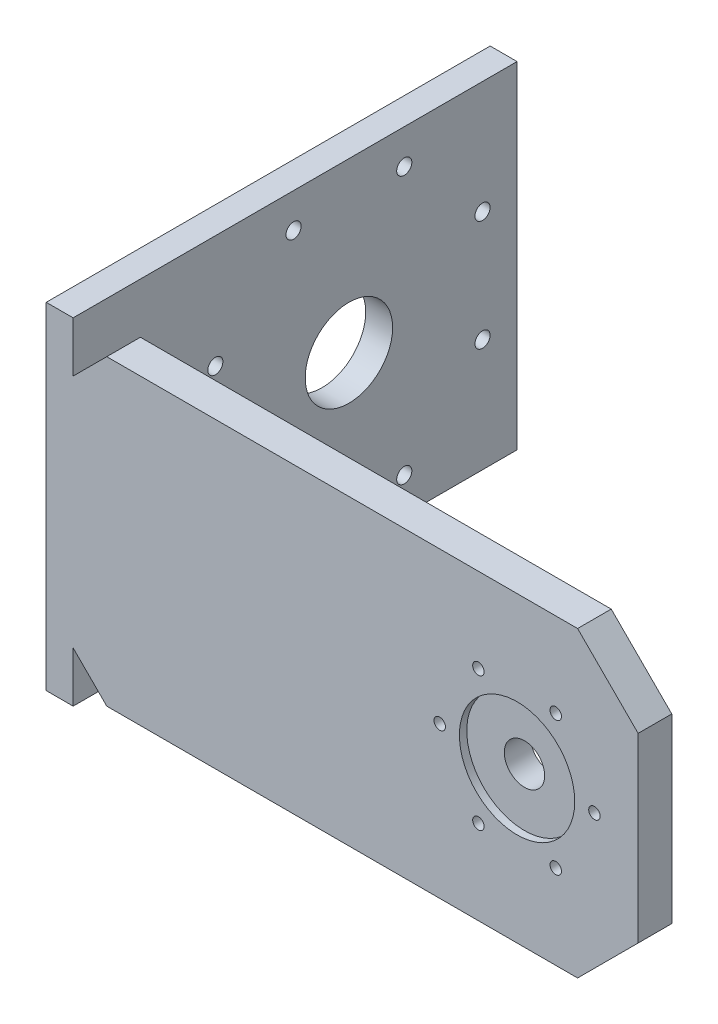
ISO-10303-21;
HEADER;
FILE_DESCRIPTION(('STEP AP214'),'2;1');
FILE_NAME('part.step','',(''),(''),'','','');
FILE_SCHEMA(('AUTOMOTIVE_DESIGN { 1 0 10303 214 1 1 1 1 }'));
ENDSEC;
DATA;
#1=APPLICATION_CONTEXT('core data for automotive mechanical design processes');
#2=APPLICATION_PROTOCOL_DEFINITION('international standard','automotive_design',2000,#1);
#3=PRODUCT_CONTEXT('',#1,'mechanical');
#4=PRODUCT('Part','Part','',(#3));
#5=PRODUCT_RELATED_PRODUCT_CATEGORY('part','',(#4));
#6=PRODUCT_DEFINITION_FORMATION('','',#4);
#7=PRODUCT_DEFINITION_CONTEXT('part definition',#1,'design');
#8=PRODUCT_DEFINITION('design','',#6,#7);
#9=PRODUCT_DEFINITION_SHAPE('','',#8);
#10=(LENGTH_UNIT() NAMED_UNIT(*) SI_UNIT(.MILLI.,.METRE.));
#11=(NAMED_UNIT(*) PLANE_ANGLE_UNIT() SI_UNIT($,.RADIAN.));
#12=(NAMED_UNIT(*) SI_UNIT($,.STERADIAN.) SOLID_ANGLE_UNIT());
#13=UNCERTAINTY_MEASURE_WITH_UNIT(LENGTH_MEASURE(1.E-05),#10,'distance_accuracy_value','');
#14=(GEOMETRIC_REPRESENTATION_CONTEXT(3) GLOBAL_UNCERTAINTY_ASSIGNED_CONTEXT((#13)) GLOBAL_UNIT_ASSIGNED_CONTEXT((#10,
#11,#12)) REPRESENTATION_CONTEXT('',''));
#15=CARTESIAN_POINT('',(0.,0.,0.));
#16=DIRECTION('',(0.,0.,1.));
#17=DIRECTION('',(1.,0.,0.));
#18=AXIS2_PLACEMENT_3D('',#15,#16,#17);
#19=CARTESIAN_POINT('',(0.,0.,72.));
#20=DIRECTION('',(0.,0.,-1.));
#21=DIRECTION('',(-1.,0.,0.));
#22=AXIS2_PLACEMENT_3D('',#19,#20,#21);
#23=PLANE('',#22);
#24=CARTESIAN_POINT('',(11.5,19.9185842870421,72.));
#25=DIRECTION('',(0.,0.,1.));
#26=DIRECTION('',(1.,0.,0.));
#27=AXIS2_PLACEMENT_3D('',#24,#25,#26);
#28=CIRCLE('',#27,1.7);
#29=CARTESIAN_POINT('',(13.2,19.9185842870421,72.));
#30=VERTEX_POINT('',#29);
#31=EDGE_CURVE('E268',#30,#30,#28,.T.);
#32=ORIENTED_EDGE('',*,*,#31,.T.);
#33=EDGE_LOOP('',(#32));
#34=FACE_BOUND('',#33,.T.);
#35=CARTESIAN_POINT('',(-23.,0.,72.));
#36=DIRECTION('',(0.,0.,1.));
#37=DIRECTION('',(1.,0.,0.));
#38=AXIS2_PLACEMENT_3D('',#35,#36,#37);
#39=CIRCLE('',#38,1.7);
#40=CARTESIAN_POINT('',(-21.3,0.,72.));
#41=VERTEX_POINT('',#40);
#42=EDGE_CURVE('E279',#41,#41,#39,.T.);
#43=ORIENTED_EDGE('',*,*,#42,.T.);
#44=EDGE_LOOP('',(#43));
#45=FACE_BOUND('',#44,.T.);
#46=CARTESIAN_POINT('',(11.5,-19.9185842870421,72.));
#47=DIRECTION('',(0.,0.,1.));
#48=DIRECTION('',(1.,0.,0.));
#49=AXIS2_PLACEMENT_3D('',#46,#47,#48);
#50=CIRCLE('',#49,1.7);
#51=CARTESIAN_POINT('',(13.2,-19.9185842870421,72.));
#52=VERTEX_POINT('',#51);
#53=EDGE_CURVE('E288',#52,#52,#50,.T.);
#54=ORIENTED_EDGE('',*,*,#53,.T.);
#55=EDGE_LOOP('',(#54));
#56=FACE_BOUND('',#55,.T.);
#57=CARTESIAN_POINT('',(23.,0.,72.));
#58=DIRECTION('',(0.,0.,1.));
#59=DIRECTION('',(1.,0.,0.));
#60=AXIS2_PLACEMENT_3D('',#57,#58,#59);
#61=CIRCLE('',#60,1.7);
#62=CARTESIAN_POINT('',(24.7,0.,72.));
#63=VERTEX_POINT('',#62);
#64=EDGE_CURVE('E299',#63,#63,#61,.T.);
#65=ORIENTED_EDGE('',*,*,#64,.T.);
#66=EDGE_LOOP('',(#65));
#67=FACE_BOUND('',#66,.T.);
#68=CARTESIAN_POINT('',(-11.5,-19.9185842870421,72.));
#69=DIRECTION('',(0.,0.,1.));
#70=DIRECTION('',(1.,0.,0.));
#71=AXIS2_PLACEMENT_3D('',#68,#69,#70);
#72=CIRCLE('',#71,1.7);
#73=CARTESIAN_POINT('',(-9.79999999999999,-19.9185842870421,72.));
#74=VERTEX_POINT('',#73);
#75=EDGE_CURVE('E283',#74,#74,#72,.T.);
#76=ORIENTED_EDGE('',*,*,#75,.T.);
#77=EDGE_LOOP('',(#76));
#78=FACE_BOUND('',#77,.T.);
#79=CARTESIAN_POINT('',(-11.5,19.9185842870421,72.));
#80=DIRECTION('',(0.,0.,1.));
#81=DIRECTION('',(1.,0.,0.));
#82=AXIS2_PLACEMENT_3D('',#79,#80,#81);
#83=CIRCLE('',#82,1.7);
#84=CARTESIAN_POINT('',(-9.80000000000001,19.9185842870421,72.));
#85=VERTEX_POINT('',#84);
#86=EDGE_CURVE('E275',#85,#85,#83,.T.);
#87=ORIENTED_EDGE('',*,*,#86,.T.);
#88=EDGE_LOOP('',(#87));
#89=FACE_BOUND('',#88,.T.);
#90=CARTESIAN_POINT('',(0.,0.,72.));
#91=DIRECTION('',(0.,0.,1.));
#92=DIRECTION('',(1.,0.,0.));
#93=AXIS2_PLACEMENT_3D('',#90,#91,#92);
#94=CIRCLE('',#93,6.);
#95=CARTESIAN_POINT('',(6.,0.,72.));
#96=VERTEX_POINT('',#95);
#97=EDGE_CURVE('E264',#96,#96,#94,.T.);
#98=ORIENTED_EDGE('',*,*,#97,.T.);
#99=EDGE_LOOP('',(#98));
#100=FACE_BOUND('',#99,.T.);
#101=DIRECTION('',(0.,1.,0.));
#102=VECTOR('',#101,1.);
#103=CARTESIAN_POINT('',(-132.,0.,72.));
#104=LINE('',#103,#102);
#105=CARTESIAN_POINT('',(-132.,-35.,72.));
#106=VERTEX_POINT('',#105);
#107=CARTESIAN_POINT('',(-132.,-4.,72.));
#108=VERTEX_POINT('',#107);
#109=EDGE_CURVE('E251',#106,#108,#104,.T.);
#110=ORIENTED_EDGE('',*,*,#109,.T.);
#111=DIRECTION('',(1.,0.,0.));
#112=VECTOR('',#111,1.);
#113=CARTESIAN_POINT('',(-30.,-4.,72.));
#114=LINE('',#113,#112);
#115=CARTESIAN_POINT('',(-30.,-4.,72.));
#116=VERTEX_POINT('',#115);
#117=EDGE_CURVE('E53',#108,#116,#114,.T.);
#118=ORIENTED_EDGE('',*,*,#117,.T.);
#119=DIRECTION('',(0.,-1.,0.));
#120=VECTOR('',#119,1.);
#121=CARTESIAN_POINT('',(-30.,4.,72.));
#122=LINE('',#121,#120);
#123=CARTESIAN_POINT('',(-30.,4.,72.));
#124=VERTEX_POINT('',#123);
#125=EDGE_CURVE('E59',#124,#116,#122,.T.);
#126=ORIENTED_EDGE('',*,*,#125,.F.);
#127=DIRECTION('',(1.,0.,0.));
#128=VECTOR('',#127,1.);
#129=CARTESIAN_POINT('',(-30.,4.,72.));
#130=LINE('',#129,#128);
#131=CARTESIAN_POINT('',(-132.,4.,72.));
#132=VERTEX_POINT('',#131);
#133=EDGE_CURVE('E159',#132,#124,#130,.T.);
#134=ORIENTED_EDGE('',*,*,#133,.F.);
#135=CARTESIAN_POINT('',(-132.,35.,72.));
#136=VERTEX_POINT('',#135);
#137=EDGE_CURVE('E252',#132,#136,#104,.T.);
#138=ORIENTED_EDGE('',*,*,#137,.T.);
#139=DIRECTION('',(-0.707106781186548,-0.707106781186547,0.));
#140=VECTOR('',#139,1.);
#141=CARTESIAN_POINT('',(-140.,27.,72.));
#142=LINE('',#141,#140);
#143=CARTESIAN_POINT('',(-122.,45.,72.));
#144=VERTEX_POINT('',#143);
#145=EDGE_CURVE('E304',#144,#136,#142,.T.);
#146=ORIENTED_EDGE('',*,*,#145,.F.);
#147=DIRECTION('',(-1.,0.,0.));
#148=VECTOR('',#147,1.);
#149=CARTESIAN_POINT('',(-122.,45.,72.));
#150=LINE('',#149,#148);
#151=CARTESIAN_POINT('',(18.,45.,72.));
#152=VERTEX_POINT('',#151);
#153=EDGE_CURVE('E310',#152,#144,#150,.T.);
#154=ORIENTED_EDGE('',*,*,#153,.F.);
#155=DIRECTION('',(-0.707106781186547,0.707106781186547,0.));
#156=VECTOR('',#155,1.);
#157=CARTESIAN_POINT('',(18.,45.,72.));
#158=LINE('',#157,#156);
#159=CARTESIAN_POINT('',(36.,27.,72.));
#160=VERTEX_POINT('',#159);
#161=EDGE_CURVE('E331',#160,#152,#158,.T.);
#162=ORIENTED_EDGE('',*,*,#161,.F.);
#163=DIRECTION('',(0.,1.,0.));
#164=VECTOR('',#163,1.);
#165=CARTESIAN_POINT('',(36.,27.,72.));
#166=LINE('',#165,#164);
#167=CARTESIAN_POINT('',(36.,-27.,72.));
#168=VERTEX_POINT('',#167);
#169=EDGE_CURVE('E335',#168,#160,#166,.T.);
#170=ORIENTED_EDGE('',*,*,#169,.F.);
#171=DIRECTION('',(0.707106781186547,0.707106781186547,0.));
#172=VECTOR('',#171,1.);
#173=CARTESIAN_POINT('',(36.,-27.,72.));
#174=LINE('',#173,#172);
#175=CARTESIAN_POINT('',(18.,-45.,72.));
#176=VERTEX_POINT('',#175);
#177=EDGE_CURVE('E329',#176,#168,#174,.T.);
#178=ORIENTED_EDGE('',*,*,#177,.F.);
#179=DIRECTION('',(1.,0.,0.));
#180=VECTOR('',#179,1.);
#181=CARTESIAN_POINT('',(18.,-45.,72.));
#182=LINE('',#181,#180);
#183=CARTESIAN_POINT('',(-122.,-45.,72.));
#184=VERTEX_POINT('',#183);
#185=EDGE_CURVE('E327',#184,#176,#182,.T.);
#186=ORIENTED_EDGE('',*,*,#185,.F.);
#187=DIRECTION('',(0.707106781186548,-0.707106781186547,0.));
#188=VECTOR('',#187,1.);
#189=CARTESIAN_POINT('',(-122.,-45.,72.));
#190=LINE('',#189,#188);
#191=EDGE_CURVE('E326',#106,#184,#190,.T.);
#192=ORIENTED_EDGE('',*,*,#191,.F.);
#193=EDGE_LOOP('',(#110,#118,#126,#134,#138,#146,#154,#162,#170,#178,#186,#192));
#194=FACE_BOUND('',#193,.T.);
#195=ADVANCED_FACE('F39',(#34,#45,#56,#67,#78,#89,#100,#194),#23,.T.);
#196=CARTESIAN_POINT('',(-140.,27.,82.));
#197=DIRECTION('',(0.707106781186547,-0.707106781186548,0.));
#198=DIRECTION('',(0.707106781186548,0.707106781186547,0.));
#199=AXIS2_PLACEMENT_3D('',#196,#197,#198);
#200=PLANE('',#199);
#201=DIRECTION('',(0.,0.,-1.));
#202=VECTOR('',#201,1.);
#203=CARTESIAN_POINT('',(-132.,35.,82.));
#204=LINE('',#203,#202);
#205=CARTESIAN_POINT('',(-132.,35.,82.));
#206=VERTEX_POINT('',#205);
#207=EDGE_CURVE('E254',#206,#136,#204,.T.);
#208=ORIENTED_EDGE('',*,*,#207,.F.);
#209=DIRECTION('',(-0.707106781186548,-0.707106781186547,0.));
#210=VECTOR('',#209,1.);
#211=CARTESIAN_POINT('',(-140.,27.,82.));
#212=LINE('',#211,#210);
#213=CARTESIAN_POINT('',(-122.,45.,82.));
#214=VERTEX_POINT('',#213);
#215=EDGE_CURVE('E303',#214,#206,#212,.T.);
#216=ORIENTED_EDGE('',*,*,#215,.F.);
#217=DIRECTION('',(0.,0.,-1.));
#218=VECTOR('',#217,1.);
#219=CARTESIAN_POINT('',(-122.,45.,82.));
#220=LINE('',#219,#218);
#221=EDGE_CURVE('E323',#214,#144,#220,.T.);
#222=ORIENTED_EDGE('',*,*,#221,.T.);
#223=ORIENTED_EDGE('',*,*,#145,.T.);
#224=EDGE_LOOP('',(#208,#216,#222,#223));
#225=FACE_BOUND('',#224,.T.);
#226=ADVANCED_FACE('F41',(#225),#200,.F.);
#227=CARTESIAN_POINT('',(-122.,-45.,82.));
#228=DIRECTION('',(0.707106781186547,0.707106781186548,0.));
#229=DIRECTION('',(-0.707106781186548,0.707106781186547,0.));
#230=AXIS2_PLACEMENT_3D('',#227,#228,#229);
#231=PLANE('',#230);
#232=DIRECTION('',(0.,0.,1.));
#233=VECTOR('',#232,1.);
#234=CARTESIAN_POINT('',(-132.,-35.,82.));
#235=LINE('',#234,#233);
#236=CARTESIAN_POINT('',(-132.,-35.,82.));
#237=VERTEX_POINT('',#236);
#238=EDGE_CURVE('E160',#106,#237,#235,.T.);
#239=ORIENTED_EDGE('',*,*,#238,.F.);
#240=ORIENTED_EDGE('',*,*,#191,.T.);
#241=DIRECTION('',(0.,0.,-1.));
#242=VECTOR('',#241,1.);
#243=CARTESIAN_POINT('',(-122.,-45.,82.));
#244=LINE('',#243,#242);
#245=CARTESIAN_POINT('',(-122.,-45.,82.));
#246=VERTEX_POINT('',#245);
#247=EDGE_CURVE('E354',#246,#184,#244,.T.);
#248=ORIENTED_EDGE('',*,*,#247,.F.);
#249=DIRECTION('',(0.707106781186548,-0.707106781186547,0.));
#250=VECTOR('',#249,1.);
#251=CARTESIAN_POINT('',(-122.,-45.,82.));
#252=LINE('',#251,#250);
#253=EDGE_CURVE('E313',#237,#246,#252,.T.);
#254=ORIENTED_EDGE('',*,*,#253,.F.);
#255=EDGE_LOOP('',(#239,#240,#248,#254));
#256=FACE_BOUND('',#255,.T.);
#257=ADVANCED_FACE('F403',(#256),#231,.F.);
#258=CARTESIAN_POINT('',(0.,0.,82.));
#259=DIRECTION('',(0.,0.,-1.));
#260=DIRECTION('',(-1.,0.,0.));
#261=AXIS2_PLACEMENT_3D('',#258,#259,#260);
#262=CYLINDRICAL_SURFACE('',#261,6.);
#263=ORIENTED_EDGE('',*,*,#97,.F.);
#264=EDGE_LOOP('',(#263));
#265=FACE_BOUND('',#264,.T.);
#266=CARTESIAN_POINT('',(0.,0.,79.8));
#267=DIRECTION('',(0.,0.,1.));
#268=DIRECTION('',(1.,0.,0.));
#269=AXIS2_PLACEMENT_3D('',#266,#267,#268);
#270=CIRCLE('',#269,6.);
#271=CARTESIAN_POINT('',(6.,0.,79.8));
#272=VERTEX_POINT('',#271);
#273=EDGE_CURVE('E265',#272,#272,#270,.T.);
#274=ORIENTED_EDGE('',*,*,#273,.T.);
#275=EDGE_LOOP('',(#274));
#276=FACE_BOUND('',#275,.T.);
#277=ADVANCED_FACE('F433',(#265,#276),#262,.F.);
#278=CARTESIAN_POINT('',(0.,0.,82.));
#279=DIRECTION('',(0.,0.,-1.));
#280=DIRECTION('',(-1.,0.,0.));
#281=AXIS2_PLACEMENT_3D('',#278,#279,#280);
#282=PLANE('',#281);
#283=CARTESIAN_POINT('',(0.,0.,82.));
#284=DIRECTION('',(0.,0.,1.));
#285=DIRECTION('',(1.,0.,0.));
#286=AXIS2_PLACEMENT_3D('',#283,#284,#285);
#287=CIRCLE('',#286,17.15);
#288=CARTESIAN_POINT('',(17.15,0.,82.));
#289=VERTEX_POINT('',#288);
#290=EDGE_CURVE('E256',#289,#289,#287,.T.);
#291=ORIENTED_EDGE('',*,*,#290,.F.);
#292=EDGE_LOOP('',(#291));
#293=FACE_BOUND('',#292,.T.);
#294=ORIENTED_EDGE('',*,*,#215,.T.);
#295=DIRECTION('',(0.,-1.,0.));
#296=VECTOR('',#295,1.);
#297=CARTESIAN_POINT('',(-132.,-50.,82.));
#298=LINE('',#297,#296);
#299=CARTESIAN_POINT('',(-132.,50.,82.));
#300=VERTEX_POINT('',#299);
#301=EDGE_CURVE('E230',#300,#206,#298,.T.);
#302=ORIENTED_EDGE('',*,*,#301,.F.);
#303=DIRECTION('',(-1.,0.,0.));
#304=VECTOR('',#303,1.);
#305=CARTESIAN_POINT('',(-132.,50.,82.));
#306=LINE('',#305,#304);
#307=CARTESIAN_POINT('',(-140.,50.,82.));
#308=VERTEX_POINT('',#307);
#309=EDGE_CURVE('E246',#300,#308,#306,.T.);
#310=ORIENTED_EDGE('',*,*,#309,.T.);
#311=DIRECTION('',(0.,-1.,0.));
#312=VECTOR('',#311,1.);
#313=CARTESIAN_POINT('',(-140.,-27.,82.));
#314=LINE('',#313,#312);
#315=CARTESIAN_POINT('',(-140.,-50.,82.));
#316=VERTEX_POINT('',#315);
#317=EDGE_CURVE('E306',#308,#316,#314,.T.);
#318=ORIENTED_EDGE('',*,*,#317,.T.);
#319=DIRECTION('',(-1.,0.,0.));
#320=VECTOR('',#319,1.);
#321=CARTESIAN_POINT('',(-132.,-50.,82.));
#322=LINE('',#321,#320);
#323=CARTESIAN_POINT('',(-132.,-50.,82.));
#324=VERTEX_POINT('',#323);
#325=EDGE_CURVE('E247',#324,#316,#322,.T.);
#326=ORIENTED_EDGE('',*,*,#325,.F.);
#327=EDGE_CURVE('E229',#237,#324,#298,.T.);
#328=ORIENTED_EDGE('',*,*,#327,.F.);
#329=ORIENTED_EDGE('',*,*,#253,.T.);
#330=DIRECTION('',(1.,0.,0.));
#331=VECTOR('',#330,1.);
#332=CARTESIAN_POINT('',(18.,-45.,82.));
#333=LINE('',#332,#331);
#334=CARTESIAN_POINT('',(18.,-45.,82.));
#335=VERTEX_POINT('',#334);
#336=EDGE_CURVE('E311',#246,#335,#333,.T.);
#337=ORIENTED_EDGE('',*,*,#336,.T.);
#338=DIRECTION('',(0.707106781186547,0.707106781186547,0.));
#339=VECTOR('',#338,1.);
#340=CARTESIAN_POINT('',(36.,-27.,82.));
#341=LINE('',#340,#339);
#342=CARTESIAN_POINT('',(36.,-27.,82.));
#343=VERTEX_POINT('',#342);
#344=EDGE_CURVE('E312',#335,#343,#341,.T.);
#345=ORIENTED_EDGE('',*,*,#344,.T.);
#346=DIRECTION('',(0.,1.,0.));
#347=VECTOR('',#346,1.);
#348=CARTESIAN_POINT('',(36.,27.,82.));
#349=LINE('',#348,#347);
#350=CARTESIAN_POINT('',(36.,27.,82.));
#351=VERTEX_POINT('',#350);
#352=EDGE_CURVE('E320',#343,#351,#349,.T.);
#353=ORIENTED_EDGE('',*,*,#352,.T.);
#354=DIRECTION('',(-0.707106781186547,0.707106781186547,0.));
#355=VECTOR('',#354,1.);
#356=CARTESIAN_POINT('',(18.,45.,82.));
#357=LINE('',#356,#355);
#358=CARTESIAN_POINT('',(18.,45.,82.));
#359=VERTEX_POINT('',#358);
#360=EDGE_CURVE('E317',#351,#359,#357,.T.);
#361=ORIENTED_EDGE('',*,*,#360,.T.);
#362=DIRECTION('',(-1.,0.,0.));
#363=VECTOR('',#362,1.);
#364=CARTESIAN_POINT('',(-122.,45.,82.));
#365=LINE('',#364,#363);
#366=EDGE_CURVE('E321',#359,#214,#365,.T.);
#367=ORIENTED_EDGE('',*,*,#366,.T.);
#368=EDGE_LOOP('',(#294,#302,#310,#318,#326,#328,#329,#337,#345,#353,#361,#367));
#369=FACE_BOUND('',#368,.T.);
#370=CARTESIAN_POINT('',(23.,0.,82.));
#371=DIRECTION('',(0.,0.,1.));
#372=DIRECTION('',(1.,0.,0.));
#373=AXIS2_PLACEMENT_3D('',#370,#371,#372);
#374=CIRCLE('',#373,1.7);
#375=CARTESIAN_POINT('',(24.7,0.,82.));
#376=VERTEX_POINT('',#375);
#377=EDGE_CURVE('E298',#376,#376,#374,.T.);
#378=ORIENTED_EDGE('',*,*,#377,.F.);
#379=EDGE_LOOP('',(#378));
#380=FACE_BOUND('',#379,.T.);
#381=CARTESIAN_POINT('',(11.5,-19.9185842870421,82.));
#382=DIRECTION('',(0.,0.,1.));
#383=DIRECTION('',(1.,0.,0.));
#384=AXIS2_PLACEMENT_3D('',#381,#382,#383);
#385=CIRCLE('',#384,1.7);
#386=CARTESIAN_POINT('',(13.2,-19.9185842870421,82.));
#387=VERTEX_POINT('',#386);
#388=EDGE_CURVE('E291',#387,#387,#385,.T.);
#389=ORIENTED_EDGE('',*,*,#388,.F.);
#390=EDGE_LOOP('',(#389));
#391=FACE_BOUND('',#390,.T.);
#392=CARTESIAN_POINT('',(-11.5,-19.9185842870421,82.));
#393=DIRECTION('',(0.,0.,1.));
#394=DIRECTION('',(1.,0.,0.));
#395=AXIS2_PLACEMENT_3D('',#392,#393,#394);
#396=CIRCLE('',#395,1.7);
#397=CARTESIAN_POINT('',(-9.79999999999999,-19.9185842870421,82.));
#398=VERTEX_POINT('',#397);
#399=EDGE_CURVE('E289',#398,#398,#396,.T.);
#400=ORIENTED_EDGE('',*,*,#399,.F.);
#401=EDGE_LOOP('',(#400));
#402=FACE_BOUND('',#401,.T.);
#403=CARTESIAN_POINT('',(-23.,0.,82.));
#404=DIRECTION('',(0.,0.,1.));
#405=DIRECTION('',(1.,0.,0.));
#406=AXIS2_PLACEMENT_3D('',#403,#404,#405);
#407=CIRCLE('',#406,1.7);
#408=CARTESIAN_POINT('',(-21.3,0.,82.));
#409=VERTEX_POINT('',#408);
#410=EDGE_CURVE('E284',#409,#409,#407,.T.);
#411=ORIENTED_EDGE('',*,*,#410,.F.);
#412=EDGE_LOOP('',(#411));
#413=FACE_BOUND('',#412,.T.);
#414=CARTESIAN_POINT('',(-11.5,19.9185842870421,82.));
#415=DIRECTION('',(0.,0.,1.));
#416=DIRECTION('',(1.,0.,0.));
#417=AXIS2_PLACEMENT_3D('',#414,#415,#416);
#418=CIRCLE('',#417,1.7);
#419=CARTESIAN_POINT('',(-9.80000000000001,19.9185842870421,82.));
#420=VERTEX_POINT('',#419);
#421=EDGE_CURVE('E274',#420,#420,#418,.T.);
#422=ORIENTED_EDGE('',*,*,#421,.F.);
#423=EDGE_LOOP('',(#422));
#424=FACE_BOUND('',#423,.T.);
#425=CARTESIAN_POINT('',(11.5,19.9185842870421,82.));
#426=DIRECTION('',(0.,0.,1.));
#427=DIRECTION('',(1.,0.,0.));
#428=AXIS2_PLACEMENT_3D('',#425,#426,#427);
#429=CIRCLE('',#428,1.7);
#430=CARTESIAN_POINT('',(13.2,19.9185842870421,82.));
#431=VERTEX_POINT('',#430);
#432=EDGE_CURVE('E267',#431,#431,#429,.T.);
#433=ORIENTED_EDGE('',*,*,#432,.F.);
#434=EDGE_LOOP('',(#433));
#435=FACE_BOUND('',#434,.T.);
#436=ADVANCED_FACE('F362',(#293,#369,#380,#391,#402,#413,#424,#435),#282,.F.);
#437=CARTESIAN_POINT('',(-140.,-27.,82.));
#438=DIRECTION('',(1.,0.,0.));
#439=DIRECTION('',(0.,0.,-1.));
#440=AXIS2_PLACEMENT_3D('',#437,#438,#439);
#441=PLANE('',#440);
#442=ORIENTED_EDGE('',*,*,#317,.F.);
#443=DIRECTION('',(0.,0.,1.));
#444=VECTOR('',#443,1.);
#445=CARTESIAN_POINT('',(-140.,50.,82.));
#446=LINE('',#445,#444);
#447=CARTESIAN_POINT('',(-140.,50.,-50.));
#448=VERTEX_POINT('',#447);
#449=EDGE_CURVE('E219',#448,#308,#446,.T.);
#450=ORIENTED_EDGE('',*,*,#449,.F.);
#451=DIRECTION('',(0.,1.,0.));
#452=VECTOR('',#451,1.);
#453=CARTESIAN_POINT('',(-140.,50.,-50.));
#454=LINE('',#453,#452);
#455=CARTESIAN_POINT('',(-140.,-50.,-50.));
#456=VERTEX_POINT('',#455);
#457=EDGE_CURVE('E226',#456,#448,#454,.T.);
#458=ORIENTED_EDGE('',*,*,#457,.F.);
#459=DIRECTION('',(0.,0.,-1.));
#460=VECTOR('',#459,1.);
#461=CARTESIAN_POINT('',(-140.,-50.,-50.));
#462=LINE('',#461,#460);
#463=EDGE_CURVE('E236',#316,#456,#462,.T.);
#464=ORIENTED_EDGE('',*,*,#463,.F.);
#465=EDGE_LOOP('',(#442,#450,#458,#464));
#466=FACE_BOUND('',#465,.T.);
#467=CARTESIAN_POINT('',(-140.,16.4553875916988,-39.7268198979853));
#468=DIRECTION('',(1.,0.,0.));
#469=DIRECTION('',(0.,0.,-1.));
#470=AXIS2_PLACEMENT_3D('',#467,#468,#469);
#471=CIRCLE('',#470,2.25);
#472=CARTESIAN_POINT('',(-140.,16.4553875916988,-41.9768198979853));
#473=VERTEX_POINT('',#472);
#474=EDGE_CURVE('E171',#473,#473,#471,.T.);
#475=ORIENTED_EDGE('',*,*,#474,.T.);
#476=EDGE_LOOP('',(#475));
#477=FACE_BOUND('',#476,.T.);
#478=CARTESIAN_POINT('',(-140.,39.7268198979853,16.4553875916988));
#479=DIRECTION('',(1.,0.,0.));
#480=DIRECTION('',(0.,0.,-1.));
#481=AXIS2_PLACEMENT_3D('',#478,#479,#480);
#482=CIRCLE('',#481,2.25);
#483=CARTESIAN_POINT('',(-140.,39.7268198979853,14.2053875916988));
#484=VERTEX_POINT('',#483);
#485=EDGE_CURVE('E184',#484,#484,#482,.T.);
#486=ORIENTED_EDGE('',*,*,#485,.T.);
#487=EDGE_LOOP('',(#486));
#488=FACE_BOUND('',#487,.T.);
#489=CARTESIAN_POINT('',(-140.,-16.4553875916989,39.7268198979853));
#490=DIRECTION('',(1.,0.,0.));
#491=DIRECTION('',(0.,0.,-1.));
#492=AXIS2_PLACEMENT_3D('',#489,#490,#491);
#493=CIRCLE('',#492,2.25);
#494=CARTESIAN_POINT('',(-140.,-16.4553875916989,37.4768198979853));
#495=VERTEX_POINT('',#494);
#496=EDGE_CURVE('E198',#495,#495,#493,.T.);
#497=ORIENTED_EDGE('',*,*,#496,.T.);
#498=EDGE_LOOP('',(#497));
#499=FACE_BOUND('',#498,.T.);
#500=CARTESIAN_POINT('',(-140.,-39.7268198979853,-16.4553875916989));
#501=DIRECTION('',(1.,0.,0.));
#502=DIRECTION('',(0.,0.,-1.));
#503=AXIS2_PLACEMENT_3D('',#500,#501,#502);
#504=CIRCLE('',#503,2.25);
#505=CARTESIAN_POINT('',(-140.,-39.7268198979853,-18.7053875916989));
#506=VERTEX_POINT('',#505);
#507=EDGE_CURVE('E208',#506,#506,#504,.T.);
#508=ORIENTED_EDGE('',*,*,#507,.T.);
#509=EDGE_LOOP('',(#508));
#510=FACE_BOUND('',#509,.T.);
#511=CARTESIAN_POINT('',(-140.,-16.4553875916989,-39.7268198979853));
#512=DIRECTION('',(1.,0.,0.));
#513=DIRECTION('',(0.,0.,-1.));
#514=AXIS2_PLACEMENT_3D('',#511,#512,#513);
#515=CIRCLE('',#514,2.25);
#516=CARTESIAN_POINT('',(-140.,-16.4553875916989,-41.9768198979853));
#517=VERTEX_POINT('',#516);
#518=EDGE_CURVE('E212',#517,#517,#515,.T.);
#519=ORIENTED_EDGE('',*,*,#518,.T.);
#520=EDGE_LOOP('',(#519));
#521=FACE_BOUND('',#520,.T.);
#522=CARTESIAN_POINT('',(-140.,-39.7268198979853,16.4553875916989));
#523=DIRECTION('',(1.,0.,0.));
#524=DIRECTION('',(0.,0.,-1.));
#525=AXIS2_PLACEMENT_3D('',#522,#523,#524);
#526=CIRCLE('',#525,2.25);
#527=CARTESIAN_POINT('',(-140.,-39.7268198979853,14.2053875916989));
#528=VERTEX_POINT('',#527);
#529=EDGE_CURVE('E205',#528,#528,#526,.T.);
#530=ORIENTED_EDGE('',*,*,#529,.T.);
#531=EDGE_LOOP('',(#530));
#532=FACE_BOUND('',#531,.T.);
#533=CARTESIAN_POINT('',(-140.,16.4553875916989,39.7268198979853));
#534=DIRECTION('',(1.,0.,0.));
#535=DIRECTION('',(0.,0.,-1.));
#536=AXIS2_PLACEMENT_3D('',#533,#534,#535);
#537=CIRCLE('',#536,2.25);
#538=CARTESIAN_POINT('',(-140.,16.4553875916989,37.4768198979853));
#539=VERTEX_POINT('',#538);
#540=EDGE_CURVE('E187',#539,#539,#537,.T.);
#541=ORIENTED_EDGE('',*,*,#540,.T.);
#542=EDGE_LOOP('',(#541));
#543=FACE_BOUND('',#542,.T.);
#544=CARTESIAN_POINT('',(-140.,39.7268198979853,-16.4553875916989));
#545=DIRECTION('',(1.,0.,0.));
#546=DIRECTION('',(0.,0.,-1.));
#547=AXIS2_PLACEMENT_3D('',#544,#545,#546);
#548=CIRCLE('',#547,2.25);
#549=CARTESIAN_POINT('',(-140.,39.7268198979853,-18.7053875916989));
#550=VERTEX_POINT('',#549);
#551=EDGE_CURVE('E180',#550,#550,#548,.T.);
#552=ORIENTED_EDGE('',*,*,#551,.T.);
#553=EDGE_LOOP('',(#552));
#554=FACE_BOUND('',#553,.T.);
#555=CARTESIAN_POINT('',(-140.,0.,0.));
#556=DIRECTION('',(1.,0.,0.));
#557=DIRECTION('',(0.,0.,-1.));
#558=AXIS2_PLACEMENT_3D('',#555,#556,#557);
#559=CIRCLE('',#558,13.);
#560=CARTESIAN_POINT('',(-140.,0.,-13.));
#561=VERTEX_POINT('',#560);
#562=EDGE_CURVE('E169',#561,#561,#559,.T.);
#563=ORIENTED_EDGE('',*,*,#562,.T.);
#564=EDGE_LOOP('',(#563));
#565=FACE_BOUND('',#564,.T.);
#566=ADVANCED_FACE('F429',(#466,#477,#488,#499,#510,#521,#532,#543,#554,#565),#441,.F.);
#567=CARTESIAN_POINT('',(18.,-45.,82.));
#568=DIRECTION('',(0.,1.,0.));
#569=DIRECTION('',(0.,0.,1.));
#570=AXIS2_PLACEMENT_3D('',#567,#568,#569);
#571=PLANE('',#570);
#572=ORIENTED_EDGE('',*,*,#185,.T.);
#573=DIRECTION('',(0.,0.,-1.));
#574=VECTOR('',#573,1.);
#575=CARTESIAN_POINT('',(18.,-45.,82.));
#576=LINE('',#575,#574);
#577=EDGE_CURVE('E346',#335,#176,#576,.T.);
#578=ORIENTED_EDGE('',*,*,#577,.F.);
#579=ORIENTED_EDGE('',*,*,#336,.F.);
#580=ORIENTED_EDGE('',*,*,#247,.T.);
#581=EDGE_LOOP('',(#572,#578,#579,#580));
#582=FACE_BOUND('',#581,.T.);
#583=ADVANCED_FACE('F426',(#582),#571,.F.);
#584=CARTESIAN_POINT('',(36.,-27.,82.));
#585=DIRECTION('',(-0.707106781186548,0.707106781186548,0.));
#586=DIRECTION('',(-0.707106781186548,-0.707106781186548,0.));
#587=AXIS2_PLACEMENT_3D('',#584,#585,#586);
#588=PLANE('',#587);
#589=ORIENTED_EDGE('',*,*,#177,.T.);
#590=DIRECTION('',(0.,0.,-1.));
#591=VECTOR('',#590,1.);
#592=CARTESIAN_POINT('',(36.,-27.,82.));
#593=LINE('',#592,#591);
#594=EDGE_CURVE('E343',#343,#168,#593,.T.);
#595=ORIENTED_EDGE('',*,*,#594,.F.);
#596=ORIENTED_EDGE('',*,*,#344,.F.);
#597=ORIENTED_EDGE('',*,*,#577,.T.);
#598=EDGE_LOOP('',(#589,#595,#596,#597));
#599=FACE_BOUND('',#598,.T.);
#600=ADVANCED_FACE('F425',(#599),#588,.F.);
#601=CARTESIAN_POINT('',(36.,27.,82.));
#602=DIRECTION('',(-1.,0.,0.));
#603=DIRECTION('',(0.,0.,1.));
#604=AXIS2_PLACEMENT_3D('',#601,#602,#603);
#605=PLANE('',#604);
#606=ORIENTED_EDGE('',*,*,#169,.T.);
#607=DIRECTION('',(0.,0.,-1.));
#608=VECTOR('',#607,1.);
#609=CARTESIAN_POINT('',(36.,27.,82.));
#610=LINE('',#609,#608);
#611=EDGE_CURVE('E344',#351,#160,#610,.T.);
#612=ORIENTED_EDGE('',*,*,#611,.F.);
#613=ORIENTED_EDGE('',*,*,#352,.F.);
#614=ORIENTED_EDGE('',*,*,#594,.T.);
#615=EDGE_LOOP('',(#606,#612,#613,#614));
#616=FACE_BOUND('',#615,.T.);
#617=ADVANCED_FACE('F416',(#616),#605,.F.);
#618=CARTESIAN_POINT('',(18.,45.,82.));
#619=DIRECTION('',(-0.707106781186548,-0.707106781186548,0.));
#620=DIRECTION('',(0.707106781186548,-0.707106781186548,0.));
#621=AXIS2_PLACEMENT_3D('',#618,#619,#620);
#622=PLANE('',#621);
#623=ORIENTED_EDGE('',*,*,#161,.T.);
#624=DIRECTION('',(0.,0.,-1.));
#625=VECTOR('',#624,1.);
#626=CARTESIAN_POINT('',(18.,45.,82.));
#627=LINE('',#626,#625);
#628=EDGE_CURVE('E338',#359,#152,#627,.T.);
#629=ORIENTED_EDGE('',*,*,#628,.F.);
#630=ORIENTED_EDGE('',*,*,#360,.F.);
#631=ORIENTED_EDGE('',*,*,#611,.T.);
#632=EDGE_LOOP('',(#623,#629,#630,#631));
#633=FACE_BOUND('',#632,.T.);
#634=ADVANCED_FACE('F411',(#633),#622,.F.);
#635=CARTESIAN_POINT('',(-122.,45.,82.));
#636=DIRECTION('',(0.,-1.,0.));
#637=DIRECTION('',(0.,0.,-1.));
#638=AXIS2_PLACEMENT_3D('',#635,#636,#637);
#639=PLANE('',#638);
#640=ORIENTED_EDGE('',*,*,#153,.T.);
#641=ORIENTED_EDGE('',*,*,#221,.F.);
#642=ORIENTED_EDGE('',*,*,#366,.F.);
#643=ORIENTED_EDGE('',*,*,#628,.T.);
#644=EDGE_LOOP('',(#640,#641,#642,#643));
#645=FACE_BOUND('',#644,.T.);
#646=ADVANCED_FACE('F407',(#645),#639,.F.);
#647=CARTESIAN_POINT('',(23.,0.,82.));
#648=DIRECTION('',(0.,0.,-1.));
#649=DIRECTION('',(-1.,0.,0.));
#650=AXIS2_PLACEMENT_3D('',#647,#648,#649);
#651=CYLINDRICAL_SURFACE('',#650,1.7);
#652=ORIENTED_EDGE('',*,*,#377,.T.);
#653=EDGE_LOOP('',(#652));
#654=FACE_BOUND('',#653,.T.);
#655=ORIENTED_EDGE('',*,*,#64,.F.);
#656=EDGE_LOOP('',(#655));
#657=FACE_BOUND('',#656,.T.);
#658=ADVANCED_FACE('F415',(#654,#657),#651,.F.);
#659=CARTESIAN_POINT('',(11.5,-19.9185842870421,82.));
#660=DIRECTION('',(0.,0.,-1.));
#661=DIRECTION('',(-1.,0.,0.));
#662=AXIS2_PLACEMENT_3D('',#659,#660,#661);
#663=CYLINDRICAL_SURFACE('',#662,1.7);
#664=ORIENTED_EDGE('',*,*,#388,.T.);
#665=EDGE_LOOP('',(#664));
#666=FACE_BOUND('',#665,.T.);
#667=ORIENTED_EDGE('',*,*,#53,.F.);
#668=EDGE_LOOP('',(#667));
#669=FACE_BOUND('',#668,.T.);
#670=ADVANCED_FACE('F529',(#666,#669),#663,.F.);
#671=CARTESIAN_POINT('',(-11.5,-19.9185842870421,82.));
#672=DIRECTION('',(0.,0.,-1.));
#673=DIRECTION('',(-1.,0.,0.));
#674=AXIS2_PLACEMENT_3D('',#671,#672,#673);
#675=CYLINDRICAL_SURFACE('',#674,1.7);
#676=ORIENTED_EDGE('',*,*,#399,.T.);
#677=EDGE_LOOP('',(#676));
#678=FACE_BOUND('',#677,.T.);
#679=ORIENTED_EDGE('',*,*,#75,.F.);
#680=EDGE_LOOP('',(#679));
#681=FACE_BOUND('',#680,.T.);
#682=ADVANCED_FACE('F528',(#678,#681),#675,.F.);
#683=CARTESIAN_POINT('',(-23.,0.,82.));
#684=DIRECTION('',(0.,0.,-1.));
#685=DIRECTION('',(-1.,0.,0.));
#686=AXIS2_PLACEMENT_3D('',#683,#684,#685);
#687=CYLINDRICAL_SURFACE('',#686,1.7);
#688=ORIENTED_EDGE('',*,*,#410,.T.);
#689=EDGE_LOOP('',(#688));
#690=FACE_BOUND('',#689,.T.);
#691=ORIENTED_EDGE('',*,*,#42,.F.);
#692=EDGE_LOOP('',(#691));
#693=FACE_BOUND('',#692,.T.);
#694=ADVANCED_FACE('F524',(#690,#693),#687,.F.);
#695=CARTESIAN_POINT('',(-11.5,19.9185842870421,82.));
#696=DIRECTION('',(0.,0.,-1.));
#697=DIRECTION('',(-1.,0.,0.));
#698=AXIS2_PLACEMENT_3D('',#695,#696,#697);
#699=CYLINDRICAL_SURFACE('',#698,1.7);
#700=ORIENTED_EDGE('',*,*,#421,.T.);
#701=EDGE_LOOP('',(#700));
#702=FACE_BOUND('',#701,.T.);
#703=ORIENTED_EDGE('',*,*,#86,.F.);
#704=EDGE_LOOP('',(#703));
#705=FACE_BOUND('',#704,.T.);
#706=ADVANCED_FACE('F520',(#702,#705),#699,.F.);
#707=CARTESIAN_POINT('',(11.5,19.9185842870421,82.));
#708=DIRECTION('',(0.,0.,-1.));
#709=DIRECTION('',(-1.,0.,0.));
#710=AXIS2_PLACEMENT_3D('',#707,#708,#709);
#711=CYLINDRICAL_SURFACE('',#710,1.7);
#712=ORIENTED_EDGE('',*,*,#432,.T.);
#713=EDGE_LOOP('',(#712));
#714=FACE_BOUND('',#713,.T.);
#715=ORIENTED_EDGE('',*,*,#31,.F.);
#716=EDGE_LOOP('',(#715));
#717=FACE_BOUND('',#716,.T.);
#718=ADVANCED_FACE('F512',(#714,#717),#711,.F.);
#719=CARTESIAN_POINT('',(0.,0.,79.8));
#720=DIRECTION('',(0.,0.,1.));
#721=DIRECTION('',(1.,0.,0.));
#722=AXIS2_PLACEMENT_3D('',#719,#720,#721);
#723=CYLINDRICAL_SURFACE('',#722,17.15);
#724=CARTESIAN_POINT('',(0.,0.,79.8));
#725=DIRECTION('',(0.,0.,1.));
#726=DIRECTION('',(1.,0.,0.));
#727=AXIS2_PLACEMENT_3D('',#724,#725,#726);
#728=CIRCLE('',#727,17.15);
#729=CARTESIAN_POINT('',(17.15,0.,79.8));
#730=VERTEX_POINT('',#729);
#731=EDGE_CURVE('E259',#730,#730,#728,.T.);
#732=ORIENTED_EDGE('',*,*,#731,.F.);
#733=EDGE_LOOP('',(#732));
#734=FACE_BOUND('',#733,.T.);
#735=ORIENTED_EDGE('',*,*,#290,.T.);
#736=EDGE_LOOP('',(#735));
#737=FACE_BOUND('',#736,.T.);
#738=ADVANCED_FACE('F509',(#734,#737),#723,.F.);
#739=CARTESIAN_POINT('',(0.,0.,79.8));
#740=DIRECTION('',(0.,0.,1.));
#741=DIRECTION('',(1.,0.,0.));
#742=AXIS2_PLACEMENT_3D('',#739,#740,#741);
#743=PLANE('',#742);
#744=ORIENTED_EDGE('',*,*,#273,.F.);
#745=EDGE_LOOP('',(#744));
#746=FACE_BOUND('',#745,.T.);
#747=ORIENTED_EDGE('',*,*,#731,.T.);
#748=EDGE_LOOP('',(#747));
#749=FACE_BOUND('',#748,.T.);
#750=ADVANCED_FACE('F500',(#746,#749),#743,.T.);
#751=CARTESIAN_POINT('',(-132.,0.,0.));
#752=DIRECTION('',(-1.,0.,0.));
#753=DIRECTION('',(0.,0.,1.));
#754=AXIS2_PLACEMENT_3D('',#751,#752,#753);
#755=PLANE('',#754);
#756=CARTESIAN_POINT('',(-132.,-16.4553875916989,-39.7268198979853));
#757=DIRECTION('',(1.,0.,0.));
#758=DIRECTION('',(0.,0.,-1.));
#759=AXIS2_PLACEMENT_3D('',#756,#757,#758);
#760=CIRCLE('',#759,2.25);
#761=CARTESIAN_POINT('',(-132.,-16.4553875916989,-41.9768198979853));
#762=VERTEX_POINT('',#761);
#763=EDGE_CURVE('E220',#762,#762,#760,.T.);
#764=ORIENTED_EDGE('',*,*,#763,.F.);
#765=EDGE_LOOP('',(#764));
#766=FACE_BOUND('',#765,.T.);
#767=CARTESIAN_POINT('',(-132.,-39.7268198979853,-16.4553875916989));
#768=DIRECTION('',(1.,0.,0.));
#769=DIRECTION('',(0.,0.,-1.));
#770=AXIS2_PLACEMENT_3D('',#767,#768,#769);
#771=CIRCLE('',#770,2.25);
#772=CARTESIAN_POINT('',(-132.,-39.7268198979853,-18.7053875916989));
#773=VERTEX_POINT('',#772);
#774=EDGE_CURVE('E211',#773,#773,#771,.T.);
#775=ORIENTED_EDGE('',*,*,#774,.F.);
#776=EDGE_LOOP('',(#775));
#777=FACE_BOUND('',#776,.T.);
#778=CARTESIAN_POINT('',(-132.,-39.7268198979853,16.4553875916989));
#779=DIRECTION('',(1.,0.,0.));
#780=DIRECTION('',(0.,0.,-1.));
#781=AXIS2_PLACEMENT_3D('',#778,#779,#780);
#782=CIRCLE('',#781,2.25);
#783=CARTESIAN_POINT('',(-132.,-39.7268198979853,14.2053875916989));
#784=VERTEX_POINT('',#783);
#785=EDGE_CURVE('E202',#784,#784,#782,.T.);
#786=ORIENTED_EDGE('',*,*,#785,.F.);
#787=EDGE_LOOP('',(#786));
#788=FACE_BOUND('',#787,.T.);
#789=CARTESIAN_POINT('',(-132.,-16.4553875916989,39.7268198979853));
#790=DIRECTION('',(1.,0.,0.));
#791=DIRECTION('',(0.,0.,-1.));
#792=AXIS2_PLACEMENT_3D('',#789,#790,#791);
#793=CIRCLE('',#792,2.25);
#794=CARTESIAN_POINT('',(-132.,-16.4553875916989,37.4768198979853));
#795=VERTEX_POINT('',#794);
#796=EDGE_CURVE('E200',#795,#795,#793,.T.);
#797=ORIENTED_EDGE('',*,*,#796,.F.);
#798=EDGE_LOOP('',(#797));
#799=FACE_BOUND('',#798,.T.);
#800=CARTESIAN_POINT('',(-132.,16.4553875916989,39.7268198979853));
#801=DIRECTION('',(1.,0.,0.));
#802=DIRECTION('',(0.,0.,-1.));
#803=AXIS2_PLACEMENT_3D('',#800,#801,#802);
#804=CIRCLE('',#803,2.25);
#805=CARTESIAN_POINT('',(-132.,16.4553875916989,37.4768198979853));
#806=VERTEX_POINT('',#805);
#807=EDGE_CURVE('E195',#806,#806,#804,.T.);
#808=ORIENTED_EDGE('',*,*,#807,.F.);
#809=EDGE_LOOP('',(#808));
#810=FACE_BOUND('',#809,.T.);
#811=CARTESIAN_POINT('',(-132.,39.7268198979853,16.4553875916988));
#812=DIRECTION('',(1.,0.,0.));
#813=DIRECTION('',(0.,0.,-1.));
#814=AXIS2_PLACEMENT_3D('',#811,#812,#813);
#815=CIRCLE('',#814,2.25);
#816=CARTESIAN_POINT('',(-132.,39.7268198979853,14.2053875916988));
#817=VERTEX_POINT('',#816);
#818=EDGE_CURVE('E186',#817,#817,#815,.T.);
#819=ORIENTED_EDGE('',*,*,#818,.F.);
#820=EDGE_LOOP('',(#819));
#821=FACE_BOUND('',#820,.T.);
#822=CARTESIAN_POINT('',(-132.,39.7268198979853,-16.4553875916989));
#823=DIRECTION('',(1.,0.,0.));
#824=DIRECTION('',(0.,0.,-1.));
#825=AXIS2_PLACEMENT_3D('',#822,#823,#824);
#826=CIRCLE('',#825,2.25);
#827=CARTESIAN_POINT('',(-132.,39.7268198979853,-18.7053875916989));
#828=VERTEX_POINT('',#827);
#829=EDGE_CURVE('E182',#828,#828,#826,.T.);
#830=ORIENTED_EDGE('',*,*,#829,.F.);
#831=EDGE_LOOP('',(#830));
#832=FACE_BOUND('',#831,.T.);
#833=CARTESIAN_POINT('',(-132.,16.4553875916988,-39.7268198979853));
#834=DIRECTION('',(1.,0.,0.));
#835=DIRECTION('',(0.,0.,-1.));
#836=AXIS2_PLACEMENT_3D('',#833,#834,#835);
#837=CIRCLE('',#836,2.25);
#838=CARTESIAN_POINT('',(-132.,16.4553875916988,-41.9768198979853));
#839=VERTEX_POINT('',#838);
#840=EDGE_CURVE('E172',#839,#839,#837,.T.);
#841=ORIENTED_EDGE('',*,*,#840,.F.);
#842=EDGE_LOOP('',(#841));
#843=FACE_BOUND('',#842,.T.);
#844=CARTESIAN_POINT('',(-132.,0.,0.));
#845=DIRECTION('',(1.,0.,0.));
#846=DIRECTION('',(0.,0.,-1.));
#847=AXIS2_PLACEMENT_3D('',#844,#845,#846);
#848=CIRCLE('',#847,13.);
#849=CARTESIAN_POINT('',(-132.,0.,-13.));
#850=VERTEX_POINT('',#849);
#851=EDGE_CURVE('E166',#850,#850,#848,.T.);
#852=ORIENTED_EDGE('',*,*,#851,.F.);
#853=EDGE_LOOP('',(#852));
#854=FACE_BOUND('',#853,.T.);
#855=ORIENTED_EDGE('',*,*,#137,.F.);
#856=DIRECTION('',(0.,0.,-1.));
#857=VECTOR('',#856,1.);
#858=CARTESIAN_POINT('',(-132.,4.,0.));
#859=LINE('',#858,#857);
#860=CARTESIAN_POINT('',(-132.,4.,53.4545454545455));
#861=VERTEX_POINT('',#860);
#862=EDGE_CURVE('E11',#132,#861,#859,.T.);
#863=ORIENTED_EDGE('',*,*,#862,.T.);
#864=DIRECTION('',(0.,1.,0.));
#865=VECTOR('',#864,1.);
#866=CARTESIAN_POINT('',(-132.,0.,53.4545454545455));
#867=LINE('',#866,#865);
#868=CARTESIAN_POINT('',(-132.,-4.,53.4545454545455));
#869=VERTEX_POINT('',#868);
#870=EDGE_CURVE('E50',#869,#861,#867,.T.);
#871=ORIENTED_EDGE('',*,*,#870,.F.);
#872=DIRECTION('',(0.,0.,-1.));
#873=VECTOR('',#872,1.);
#874=CARTESIAN_POINT('',(-132.,-4.,0.));
#875=LINE('',#874,#873);
#876=EDGE_CURVE('E150',#108,#869,#875,.T.);
#877=ORIENTED_EDGE('',*,*,#876,.F.);
#878=ORIENTED_EDGE('',*,*,#109,.F.);
#879=ORIENTED_EDGE('',*,*,#238,.T.);
#880=ORIENTED_EDGE('',*,*,#327,.T.);
#881=DIRECTION('',(0.,0.,-1.));
#882=VECTOR('',#881,1.);
#883=CARTESIAN_POINT('',(-132.,-50.,-50.));
#884=LINE('',#883,#882);
#885=CARTESIAN_POINT('',(-132.,-50.,-50.));
#886=VERTEX_POINT('',#885);
#887=EDGE_CURVE('E232',#324,#886,#884,.T.);
#888=ORIENTED_EDGE('',*,*,#887,.T.);
#889=DIRECTION('',(0.,1.,0.));
#890=VECTOR('',#889,1.);
#891=CARTESIAN_POINT('',(-132.,50.,-50.));
#892=LINE('',#891,#890);
#893=CARTESIAN_POINT('',(-132.,50.,-50.));
#894=VERTEX_POINT('',#893);
#895=EDGE_CURVE('E235',#886,#894,#892,.T.);
#896=ORIENTED_EDGE('',*,*,#895,.T.);
#897=DIRECTION('',(0.,0.,1.));
#898=VECTOR('',#897,1.);
#899=CARTESIAN_POINT('',(-132.,50.,82.));
#900=LINE('',#899,#898);
#901=EDGE_CURVE('E224',#894,#300,#900,.T.);
#902=ORIENTED_EDGE('',*,*,#901,.T.);
#903=ORIENTED_EDGE('',*,*,#301,.T.);
#904=ORIENTED_EDGE('',*,*,#207,.T.);
#905=EDGE_LOOP('',(#855,#863,#871,#877,#878,#879,#880,#888,#896,#902,#903,#904));
#906=FACE_BOUND('',#905,.T.);
#907=ADVANCED_FACE('F144',(#766,#777,#788,#799,#810,#821,#832,#843,#854,#906),#755,.F.);
#908=CARTESIAN_POINT('',(-132.,50.,82.));
#909=DIRECTION('',(0.,-1.,0.));
#910=DIRECTION('',(0.,0.,-1.));
#911=AXIS2_PLACEMENT_3D('',#908,#909,#910);
#912=PLANE('',#911);
#913=ORIENTED_EDGE('',*,*,#449,.T.);
#914=ORIENTED_EDGE('',*,*,#309,.F.);
#915=ORIENTED_EDGE('',*,*,#901,.F.);
#916=DIRECTION('',(-1.,0.,0.));
#917=VECTOR('',#916,1.);
#918=CARTESIAN_POINT('',(-132.,50.,-50.));
#919=LINE('',#918,#917);
#920=EDGE_CURVE('E233',#894,#448,#919,.T.);
#921=ORIENTED_EDGE('',*,*,#920,.T.);
#922=EDGE_LOOP('',(#913,#914,#915,#921));
#923=FACE_BOUND('',#922,.T.);
#924=ADVANCED_FACE('F377',(#923),#912,.F.);
#925=CARTESIAN_POINT('',(-132.,-50.,-50.));
#926=DIRECTION('',(0.,1.,0.));
#927=DIRECTION('',(0.,0.,1.));
#928=AXIS2_PLACEMENT_3D('',#925,#926,#927);
#929=PLANE('',#928);
#930=ORIENTED_EDGE('',*,*,#463,.T.);
#931=DIRECTION('',(-1.,0.,0.));
#932=VECTOR('',#931,1.);
#933=CARTESIAN_POINT('',(-132.,-50.,-50.));
#934=LINE('',#933,#932);
#935=EDGE_CURVE('E245',#886,#456,#934,.T.);
#936=ORIENTED_EDGE('',*,*,#935,.F.);
#937=ORIENTED_EDGE('',*,*,#887,.F.);
#938=ORIENTED_EDGE('',*,*,#325,.T.);
#939=EDGE_LOOP('',(#930,#936,#937,#938));
#940=FACE_BOUND('',#939,.T.);
#941=ADVANCED_FACE('F369',(#940),#929,.F.);
#942=CARTESIAN_POINT('',(-132.,50.,-50.));
#943=DIRECTION('',(0.,0.,1.));
#944=DIRECTION('',(1.,0.,0.));
#945=AXIS2_PLACEMENT_3D('',#942,#943,#944);
#946=PLANE('',#945);
#947=ORIENTED_EDGE('',*,*,#457,.T.);
#948=ORIENTED_EDGE('',*,*,#920,.F.);
#949=ORIENTED_EDGE('',*,*,#895,.F.);
#950=ORIENTED_EDGE('',*,*,#935,.T.);
#951=EDGE_LOOP('',(#947,#948,#949,#950));
#952=FACE_BOUND('',#951,.T.);
#953=ADVANCED_FACE('F374',(#952),#946,.F.);
#954=CARTESIAN_POINT('',(-132.,-16.4553875916989,-39.7268198979853));
#955=DIRECTION('',(-1.,0.,0.));
#956=DIRECTION('',(0.,0.,1.));
#957=AXIS2_PLACEMENT_3D('',#954,#955,#956);
#958=CYLINDRICAL_SURFACE('',#957,2.25);
#959=ORIENTED_EDGE('',*,*,#763,.T.);
#960=EDGE_LOOP('',(#959));
#961=FACE_BOUND('',#960,.T.);
#962=ORIENTED_EDGE('',*,*,#518,.F.);
#963=EDGE_LOOP('',(#962));
#964=FACE_BOUND('',#963,.T.);
#965=ADVANCED_FACE('F491',(#961,#964),#958,.F.);
#966=CARTESIAN_POINT('',(-132.,-39.7268198979853,-16.4553875916989));
#967=DIRECTION('',(-1.,0.,0.));
#968=DIRECTION('',(0.,0.,1.));
#969=AXIS2_PLACEMENT_3D('',#966,#967,#968);
#970=CYLINDRICAL_SURFACE('',#969,2.25);
#971=ORIENTED_EDGE('',*,*,#774,.T.);
#972=EDGE_LOOP('',(#971));
#973=FACE_BOUND('',#972,.T.);
#974=ORIENTED_EDGE('',*,*,#507,.F.);
#975=EDGE_LOOP('',(#974));
#976=FACE_BOUND('',#975,.T.);
#977=ADVANCED_FACE('F490',(#973,#976),#970,.F.);
#978=CARTESIAN_POINT('',(-132.,-39.7268198979853,16.4553875916989));
#979=DIRECTION('',(-1.,0.,0.));
#980=DIRECTION('',(0.,0.,1.));
#981=AXIS2_PLACEMENT_3D('',#978,#979,#980);
#982=CYLINDRICAL_SURFACE('',#981,2.25);
#983=ORIENTED_EDGE('',*,*,#785,.T.);
#984=EDGE_LOOP('',(#983));
#985=FACE_BOUND('',#984,.T.);
#986=ORIENTED_EDGE('',*,*,#529,.F.);
#987=EDGE_LOOP('',(#986));
#988=FACE_BOUND('',#987,.T.);
#989=ADVANCED_FACE('F483',(#985,#988),#982,.F.);
#990=CARTESIAN_POINT('',(-132.,-16.4553875916989,39.7268198979853));
#991=DIRECTION('',(-1.,0.,0.));
#992=DIRECTION('',(0.,0.,1.));
#993=AXIS2_PLACEMENT_3D('',#990,#991,#992);
#994=CYLINDRICAL_SURFACE('',#993,2.25);
#995=ORIENTED_EDGE('',*,*,#796,.T.);
#996=EDGE_LOOP('',(#995));
#997=FACE_BOUND('',#996,.T.);
#998=ORIENTED_EDGE('',*,*,#496,.F.);
#999=EDGE_LOOP('',(#998));
#1000=FACE_BOUND('',#999,.T.);
#1001=ADVANCED_FACE('F479',(#997,#1000),#994,.F.);
#1002=CARTESIAN_POINT('',(-132.,16.4553875916989,39.7268198979853));
#1003=DIRECTION('',(-1.,0.,0.));
#1004=DIRECTION('',(0.,0.,1.));
#1005=AXIS2_PLACEMENT_3D('',#1002,#1003,#1004);
#1006=CYLINDRICAL_SURFACE('',#1005,2.25);
#1007=ORIENTED_EDGE('',*,*,#807,.T.);
#1008=EDGE_LOOP('',(#1007));
#1009=FACE_BOUND('',#1008,.T.);
#1010=ORIENTED_EDGE('',*,*,#540,.F.);
#1011=EDGE_LOOP('',(#1010));
#1012=FACE_BOUND('',#1011,.T.);
#1013=ADVANCED_FACE('F474',(#1009,#1012),#1006,.F.);
#1014=CARTESIAN_POINT('',(-132.,39.7268198979853,16.4553875916988));
#1015=DIRECTION('',(-1.,0.,0.));
#1016=DIRECTION('',(0.,0.,1.));
#1017=AXIS2_PLACEMENT_3D('',#1014,#1015,#1016);
#1018=CYLINDRICAL_SURFACE('',#1017,2.25);
#1019=ORIENTED_EDGE('',*,*,#818,.T.);
#1020=EDGE_LOOP('',(#1019));
#1021=FACE_BOUND('',#1020,.T.);
#1022=ORIENTED_EDGE('',*,*,#485,.F.);
#1023=EDGE_LOOP('',(#1022));
#1024=FACE_BOUND('',#1023,.T.);
#1025=ADVANCED_FACE('F473',(#1021,#1024),#1018,.F.);
#1026=CARTESIAN_POINT('',(-132.,39.7268198979853,-16.4553875916989));
#1027=DIRECTION('',(-1.,0.,0.));
#1028=DIRECTION('',(0.,0.,1.));
#1029=AXIS2_PLACEMENT_3D('',#1026,#1027,#1028);
#1030=CYLINDRICAL_SURFACE('',#1029,2.25);
#1031=ORIENTED_EDGE('',*,*,#829,.T.);
#1032=EDGE_LOOP('',(#1031));
#1033=FACE_BOUND('',#1032,.T.);
#1034=ORIENTED_EDGE('',*,*,#551,.F.);
#1035=EDGE_LOOP('',(#1034));
#1036=FACE_BOUND('',#1035,.T.);
#1037=ADVANCED_FACE('F462',(#1033,#1036),#1030,.F.);
#1038=CARTESIAN_POINT('',(-132.,16.4553875916988,-39.7268198979853));
#1039=DIRECTION('',(-1.,0.,0.));
#1040=DIRECTION('',(0.,0.,1.));
#1041=AXIS2_PLACEMENT_3D('',#1038,#1039,#1040);
#1042=CYLINDRICAL_SURFACE('',#1041,2.25);
#1043=ORIENTED_EDGE('',*,*,#840,.T.);
#1044=EDGE_LOOP('',(#1043));
#1045=FACE_BOUND('',#1044,.T.);
#1046=ORIENTED_EDGE('',*,*,#474,.F.);
#1047=EDGE_LOOP('',(#1046));
#1048=FACE_BOUND('',#1047,.T.);
#1049=ADVANCED_FACE('F459',(#1045,#1048),#1042,.F.);
#1050=CARTESIAN_POINT('',(-132.,0.,0.));
#1051=DIRECTION('',(-1.,0.,0.));
#1052=DIRECTION('',(0.,0.,1.));
#1053=AXIS2_PLACEMENT_3D('',#1050,#1051,#1052);
#1054=CYLINDRICAL_SURFACE('',#1053,13.);
#1055=ORIENTED_EDGE('',*,*,#851,.T.);
#1056=EDGE_LOOP('',(#1055));
#1057=FACE_BOUND('',#1056,.T.);
#1058=ORIENTED_EDGE('',*,*,#562,.F.);
#1059=EDGE_LOOP('',(#1058));
#1060=FACE_BOUND('',#1059,.T.);
#1061=ADVANCED_FACE('F392',(#1057,#1060),#1054,.F.);
#1062=CARTESIAN_POINT('',(-140.,4.,52.));
#1063=DIRECTION('',(-0.178885438199983,0.,0.983869910099907));
#1064=DIRECTION('',(0.983869910099907,0.,0.178885438199983));
#1065=AXIS2_PLACEMENT_3D('',#1062,#1063,#1064);
#1066=PLANE('',#1065);
#1067=DIRECTION('',(-0.983869910099907,0.,-0.178885438199983));
#1068=VECTOR('',#1067,1.);
#1069=CARTESIAN_POINT('',(-140.,-4.,52.));
#1070=LINE('',#1069,#1068);
#1071=EDGE_CURVE('E156',#116,#869,#1070,.T.);
#1072=ORIENTED_EDGE('',*,*,#1071,.T.);
#1073=ORIENTED_EDGE('',*,*,#870,.T.);
#1074=DIRECTION('',(-0.983869910099907,0.,-0.178885438199983));
#1075=VECTOR('',#1074,1.);
#1076=CARTESIAN_POINT('',(-140.,4.,52.));
#1077=LINE('',#1076,#1075);
#1078=EDGE_CURVE('E165',#124,#861,#1077,.T.);
#1079=ORIENTED_EDGE('',*,*,#1078,.F.);
#1080=ORIENTED_EDGE('',*,*,#125,.T.);
#1081=EDGE_LOOP('',(#1072,#1073,#1079,#1080));
#1082=FACE_BOUND('',#1081,.T.);
#1083=ADVANCED_FACE('F157',(#1082),#1066,.F.);
#1084=CARTESIAN_POINT('',(0.,4.,0.));
#1085=DIRECTION('',(0.,1.,0.));
#1086=DIRECTION('',(0.,0.,1.));
#1087=AXIS2_PLACEMENT_3D('',#1084,#1085,#1086);
#1088=PLANE('',#1087);
#1089=ORIENTED_EDGE('',*,*,#862,.F.);
#1090=ORIENTED_EDGE('',*,*,#133,.T.);
#1091=ORIENTED_EDGE('',*,*,#1078,.T.);
#1092=EDGE_LOOP('',(#1089,#1090,#1091));
#1093=FACE_BOUND('',#1092,.T.);
#1094=ADVANCED_FACE('F390',(#1093),#1088,.T.);
#1095=CARTESIAN_POINT('',(0.,-4.,0.));
#1096=DIRECTION('',(0.,1.,0.));
#1097=DIRECTION('',(0.,0.,1.));
#1098=AXIS2_PLACEMENT_3D('',#1095,#1096,#1097);
#1099=PLANE('',#1098);
#1100=ORIENTED_EDGE('',*,*,#117,.F.);
#1101=ORIENTED_EDGE('',*,*,#876,.T.);
#1102=ORIENTED_EDGE('',*,*,#1071,.F.);
#1103=EDGE_LOOP('',(#1100,#1101,#1102));
#1104=FACE_BOUND('',#1103,.T.);
#1105=ADVANCED_FACE('F154',(#1104),#1099,.F.);
#1106=CLOSED_SHELL('',(#195,#226,#257,#277,#436,#566,#583,#600,#617,#634,#646,#658,#670,#682,
#694,#706,#718,#738,#750,#907,#924,#941,#953,#965,#977,#989,#1001,#1013,#1025,#1037,#1049,#1061,
#1083,#1094,#1105));
#1107=MANIFOLD_SOLID_BREP('B2',#1106);
#1108=ADVANCED_BREP_SHAPE_REPRESENTATION('',(#18,#1107),#14);
#1109=SHAPE_DEFINITION_REPRESENTATION(#9,#1108);
ENDSEC;
END-ISO-10303-21;
